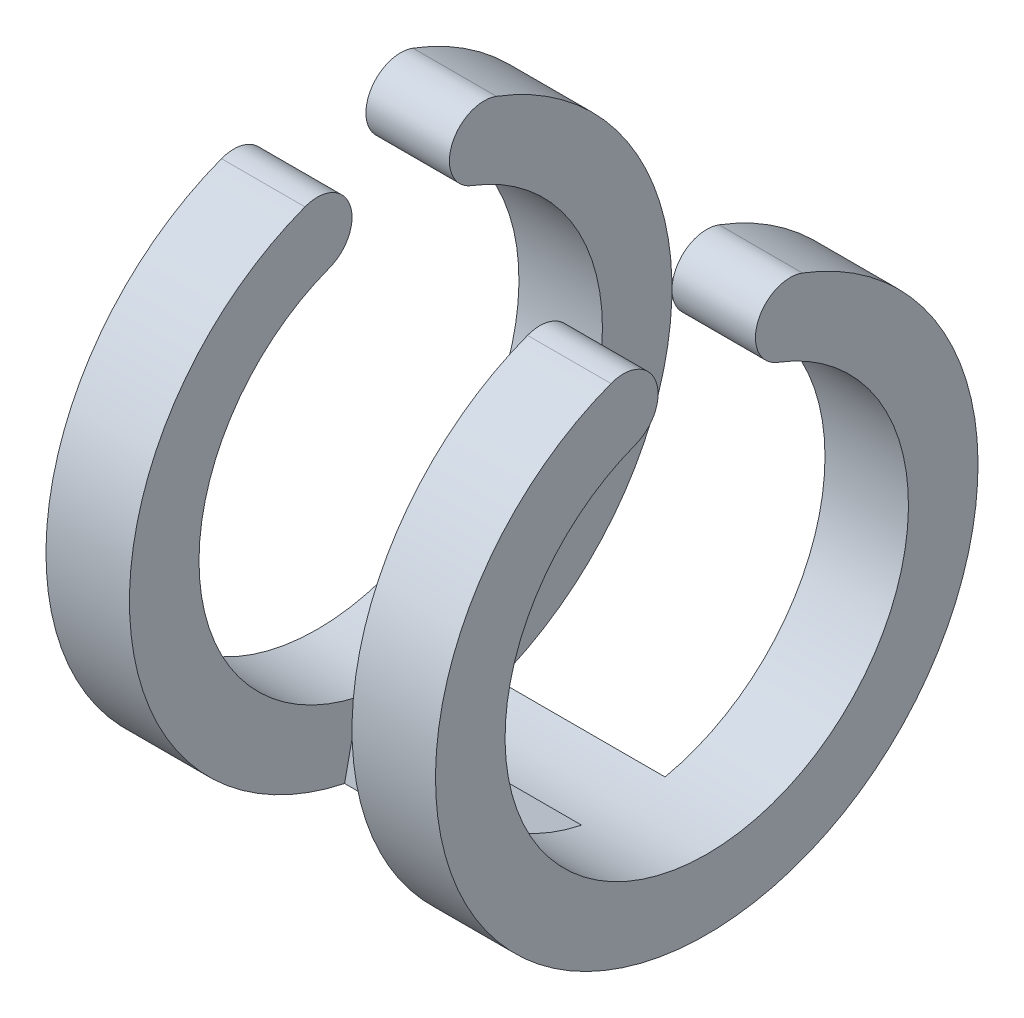
ISO-10303-21;
HEADER;
FILE_DESCRIPTION(('STEP AP214'),'2;1');
FILE_NAME('part.step','',(''),(''),'','','');
FILE_SCHEMA(('AUTOMOTIVE_DESIGN { 1 0 10303 214 1 1 1 1 }'));
ENDSEC;
DATA;
#1=APPLICATION_CONTEXT('core data for automotive mechanical design processes');
#2=APPLICATION_PROTOCOL_DEFINITION('international standard','automotive_design',2000,#1);
#3=PRODUCT_CONTEXT('',#1,'mechanical');
#4=PRODUCT('Part','Part','',(#3));
#5=PRODUCT_RELATED_PRODUCT_CATEGORY('part','',(#4));
#6=PRODUCT_DEFINITION_FORMATION('','',#4);
#7=PRODUCT_DEFINITION_CONTEXT('part definition',#1,'design');
#8=PRODUCT_DEFINITION('design','',#6,#7);
#9=PRODUCT_DEFINITION_SHAPE('','',#8);
#10=(LENGTH_UNIT() NAMED_UNIT(*) SI_UNIT(.MILLI.,.METRE.));
#11=(NAMED_UNIT(*) PLANE_ANGLE_UNIT() SI_UNIT($,.RADIAN.));
#12=(NAMED_UNIT(*) SI_UNIT($,.STERADIAN.) SOLID_ANGLE_UNIT());
#13=UNCERTAINTY_MEASURE_WITH_UNIT(LENGTH_MEASURE(1.E-05),#10,'distance_accuracy_value','');
#14=(GEOMETRIC_REPRESENTATION_CONTEXT(3) GLOBAL_UNCERTAINTY_ASSIGNED_CONTEXT((#13)) GLOBAL_UNIT_ASSIGNED_CONTEXT((#10,
#11,#12)) REPRESENTATION_CONTEXT('',''));
#15=CARTESIAN_POINT('',(0.,0.,0.));
#16=DIRECTION('',(0.,0.,1.));
#17=DIRECTION('',(1.,0.,0.));
#18=AXIS2_PLACEMENT_3D('',#15,#16,#17);
#19=CARTESIAN_POINT('',(75.5,15.7264934301467,-3.));
#20=DIRECTION('',(1.,0.,0.));
#21=DIRECTION('',(0.,1.,0.));
#22=AXIS2_PLACEMENT_3D('',#19,#20,#21);
#23=PLANE('',#22);
#24=CARTESIAN_POINT('',(75.5,23.9529868602934,0.));
#25=DIRECTION('',(1.,0.,0.));
#26=DIRECTION('',(0.,-0.935645512975694,-0.352941176470598));
#27=AXIS2_PLACEMENT_3D('',#24,#25,#26);
#28=CIRCLE('',#27,1.24999999999995);
#29=CARTESIAN_POINT('',(75.5,22.7834299690738,-0.44117647058823));
#30=VERTEX_POINT('',#29);
#31=CARTESIAN_POINT('',(75.5,25.122543751513,0.441176470588231));
#32=VERTEX_POINT('',#31);
#33=EDGE_CURVE('E11',#30,#32,#28,.T.);
#34=ORIENTED_EDGE('',*,*,#33,.F.);
#35=CARTESIAN_POINT('',(75.5,16.,-3.));
#36=DIRECTION('',(1.,0.,0.));
#37=DIRECTION('',(0.,0.935645512975698,0.352941176470589));
#38=AXIS2_PLACEMENT_3D('',#35,#36,#37);
#39=CIRCLE('',#38,7.25);
#40=CARTESIAN_POINT('',(75.5,22.7834299690738,-5.55882352941176));
#41=VERTEX_POINT('',#40);
#42=EDGE_CURVE('E187',#30,#41,#39,.T.);
#43=ORIENTED_EDGE('',*,*,#42,.T.);
#44=CARTESIAN_POINT('',(75.5,23.9529868602934,-6.));
#45=DIRECTION('',(1.,0.,0.));
#46=DIRECTION('',(0.,0.935645512975701,-0.35294117647058));
#47=AXIS2_PLACEMENT_3D('',#44,#45,#46);
#48=CIRCLE('',#47,1.25000000000004);
#49=CARTESIAN_POINT('',(75.5,25.1225437515131,-6.44117647058824));
#50=VERTEX_POINT('',#49);
#51=EDGE_CURVE('E197',#50,#41,#48,.T.);
#52=ORIENTED_EDGE('',*,*,#51,.F.);
#53=CARTESIAN_POINT('',(75.5,16.,-3.));
#54=DIRECTION('',(1.,0.,0.));
#55=DIRECTION('',(0.,0.935645512975698,0.352941176470589));
#56=AXIS2_PLACEMENT_3D('',#53,#54,#55);
#57=CIRCLE('',#56,9.75);
#58=EDGE_CURVE('E49',#32,#50,#57,.T.);
#59=ORIENTED_EDGE('',*,*,#58,.F.);
#60=EDGE_LOOP('',(#34,#43,#52,#59));
#61=FACE_BOUND('',#60,.T.);
#62=ADVANCED_FACE('F17',(#61),#23,.F.);
#63=CARTESIAN_POINT('',(75.5,23.9529868602934,0.));
#64=DIRECTION('',(1.,0.,0.));
#65=DIRECTION('',(0.,-0.935645512975694,-0.352941176470598));
#66=AXIS2_PLACEMENT_3D('',#63,#64,#65);
#67=CYLINDRICAL_SURFACE('',#66,1.24999999999995);
#68=ORIENTED_EDGE('',*,*,#33,.T.);
#69=DIRECTION('',(1.,0.,0.));
#70=VECTOR('',#69,1.);
#71=CARTESIAN_POINT('',(75.5,25.122543751513,0.441176470588231));
#72=LINE('',#71,#70);
#73=CARTESIAN_POINT('',(78.5,25.122543751513,0.441176470588231));
#74=VERTEX_POINT('',#73);
#75=EDGE_CURVE('E26',#32,#74,#72,.T.);
#76=ORIENTED_EDGE('',*,*,#75,.T.);
#77=CARTESIAN_POINT('',(78.5,23.9529868602934,0.));
#78=DIRECTION('',(1.,0.,0.));
#79=DIRECTION('',(0.,-0.935645512975694,-0.352941176470598));
#80=AXIS2_PLACEMENT_3D('',#77,#78,#79);
#81=CIRCLE('',#80,1.24999999999995);
#82=CARTESIAN_POINT('',(78.5,22.7834299690738,-0.44117647058823));
#83=VERTEX_POINT('',#82);
#84=EDGE_CURVE('E195',#83,#74,#81,.T.);
#85=ORIENTED_EDGE('',*,*,#84,.F.);
#86=DIRECTION('',(1.,0.,0.));
#87=VECTOR('',#86,1.);
#88=CARTESIAN_POINT('',(75.5,22.7834299690738,-0.44117647058823));
#89=LINE('',#88,#87);
#90=EDGE_CURVE('E71',#30,#83,#89,.T.);
#91=ORIENTED_EDGE('',*,*,#90,.F.);
#92=EDGE_LOOP('',(#68,#76,#85,#91));
#93=FACE_BOUND('',#92,.T.);
#94=ADVANCED_FACE('F394',(#93),#67,.T.);
#95=CARTESIAN_POINT('',(75.5,16.,-3.));
#96=DIRECTION('',(1.,0.,0.));
#97=DIRECTION('',(0.,-1.,0.));
#98=AXIS2_PLACEMENT_3D('',#95,#96,#97);
#99=CYLINDRICAL_SURFACE('',#98,9.75);
#100=ORIENTED_EDGE('',*,*,#58,.T.);
#101=DIRECTION('',(1.,0.,0.));
#102=VECTOR('',#101,1.);
#103=CARTESIAN_POINT('',(75.5,25.1225437515131,-6.44117647058824));
#104=LINE('',#103,#102);
#105=CARTESIAN_POINT('',(78.5,25.1225437515131,-6.44117647058824));
#106=VERTEX_POINT('',#105);
#107=EDGE_CURVE('E186',#50,#106,#104,.T.);
#108=ORIENTED_EDGE('',*,*,#107,.T.);
#109=CARTESIAN_POINT('',(78.5,16.,-3.));
#110=DIRECTION('',(1.,0.,0.));
#111=DIRECTION('',(0.,0.935645512975698,0.352941176470589));
#112=AXIS2_PLACEMENT_3D('',#109,#110,#111);
#113=CIRCLE('',#112,9.75);
#114=CARTESIAN_POINT('',(78.5,6.46096245852886,-5.01724137931027));
#115=VERTEX_POINT('',#114);
#116=EDGE_CURVE('E83',#115,#106,#113,.T.);
#117=ORIENTED_EDGE('',*,*,#116,.F.);
#118=DIRECTION('',(1.,0.,0.));
#119=VECTOR('',#118,1.);
#120=CARTESIAN_POINT('',(78.5,6.46096245852886,-5.01724137931027));
#121=LINE('',#120,#119);
#122=CARTESIAN_POINT('',(86.5,6.46096245852886,-5.01724137931027));
#123=VERTEX_POINT('',#122);
#124=EDGE_CURVE('E159',#115,#123,#121,.T.);
#125=ORIENTED_EDGE('',*,*,#124,.T.);
#126=CARTESIAN_POINT('',(86.5,16.,-3.));
#127=DIRECTION('',(1.,0.,0.));
#128=DIRECTION('',(0.,0.935645512975697,0.352941176470591));
#129=AXIS2_PLACEMENT_3D('',#126,#127,#128);
#130=CIRCLE('',#129,9.75);
#131=CARTESIAN_POINT('',(86.5,25.1225437515131,-6.44117647058824));
#132=VERTEX_POINT('',#131);
#133=EDGE_CURVE('E157',#123,#132,#130,.T.);
#134=ORIENTED_EDGE('',*,*,#133,.T.);
#135=DIRECTION('',(1.,0.,0.));
#136=VECTOR('',#135,1.);
#137=CARTESIAN_POINT('',(86.5,25.1225437515131,-6.44117647058824));
#138=LINE('',#137,#136);
#139=CARTESIAN_POINT('',(89.5,25.1225437515131,-6.44117647058824));
#140=VERTEX_POINT('',#139);
#141=EDGE_CURVE('E144',#132,#140,#138,.T.);
#142=ORIENTED_EDGE('',*,*,#141,.T.);
#143=CARTESIAN_POINT('',(89.5,16.,-3.));
#144=DIRECTION('',(1.,0.,0.));
#145=DIRECTION('',(0.,0.935645512975697,0.352941176470591));
#146=AXIS2_PLACEMENT_3D('',#143,#144,#145);
#147=CIRCLE('',#146,9.75);
#148=CARTESIAN_POINT('',(89.5,25.1225437515131,0.441176470588232));
#149=VERTEX_POINT('',#148);
#150=EDGE_CURVE('E227',#149,#140,#147,.T.);
#151=ORIENTED_EDGE('',*,*,#150,.F.);
#152=DIRECTION('',(1.,0.,0.));
#153=VECTOR('',#152,1.);
#154=CARTESIAN_POINT('',(86.5,25.1225437515131,0.441176470588232));
#155=LINE('',#154,#153);
#156=CARTESIAN_POINT('',(86.5,25.1225437515131,0.441176470588232));
#157=VERTEX_POINT('',#156);
#158=EDGE_CURVE('E154',#157,#149,#155,.T.);
#159=ORIENTED_EDGE('',*,*,#158,.F.);
#160=CARTESIAN_POINT('',(86.5,16.,-3.));
#161=DIRECTION('',(1.,0.,0.));
#162=DIRECTION('',(0.,0.935645512975697,0.352941176470591));
#163=AXIS2_PLACEMENT_3D('',#160,#161,#162);
#164=CIRCLE('',#163,9.75);
#165=CARTESIAN_POINT('',(86.5,6.46096245852886,-0.982758620689727));
#166=VERTEX_POINT('',#165);
#167=EDGE_CURVE('E183',#157,#166,#164,.T.);
#168=ORIENTED_EDGE('',*,*,#167,.T.);
#169=DIRECTION('',(1.,0.,0.));
#170=VECTOR('',#169,1.);
#171=CARTESIAN_POINT('',(78.5,6.46096245852886,-0.982758620689727));
#172=LINE('',#171,#170);
#173=CARTESIAN_POINT('',(78.5,6.46096245852886,-0.982758620689727));
#174=VERTEX_POINT('',#173);
#175=EDGE_CURVE('E251',#174,#166,#172,.T.);
#176=ORIENTED_EDGE('',*,*,#175,.F.);
#177=CARTESIAN_POINT('',(78.5,16.,-3.));
#178=DIRECTION('',(1.,0.,0.));
#179=DIRECTION('',(0.,0.935645512975698,0.352941176470589));
#180=AXIS2_PLACEMENT_3D('',#177,#178,#179);
#181=CIRCLE('',#180,9.75);
#182=EDGE_CURVE('E192',#74,#174,#181,.T.);
#183=ORIENTED_EDGE('',*,*,#182,.F.);
#184=ORIENTED_EDGE('',*,*,#75,.F.);
#185=EDGE_LOOP('',(#100,#108,#117,#125,#134,#142,#151,#159,#168,#176,#183,#184));
#186=FACE_BOUND('',#185,.T.);
#187=ADVANCED_FACE('F158',(#186),#99,.T.);
#188=CARTESIAN_POINT('',(75.5,23.9529868602934,-6.));
#189=DIRECTION('',(1.,0.,0.));
#190=DIRECTION('',(0.,0.935645512975701,-0.35294117647058));
#191=AXIS2_PLACEMENT_3D('',#188,#189,#190);
#192=CYLINDRICAL_SURFACE('',#191,1.25000000000004);
#193=ORIENTED_EDGE('',*,*,#51,.T.);
#194=DIRECTION('',(1.,0.,0.));
#195=VECTOR('',#194,1.);
#196=CARTESIAN_POINT('',(75.5,22.7834299690738,-5.55882352941176));
#197=LINE('',#196,#195);
#198=CARTESIAN_POINT('',(78.5,22.7834299690738,-5.55882352941176));
#199=VERTEX_POINT('',#198);
#200=EDGE_CURVE('E199',#41,#199,#197,.T.);
#201=ORIENTED_EDGE('',*,*,#200,.T.);
#202=CARTESIAN_POINT('',(78.5,23.9529868602934,-6.));
#203=DIRECTION('',(1.,0.,0.));
#204=DIRECTION('',(0.,0.935645512975701,-0.35294117647058));
#205=AXIS2_PLACEMENT_3D('',#202,#203,#204);
#206=CIRCLE('',#205,1.25000000000004);
#207=EDGE_CURVE('E225',#106,#199,#206,.T.);
#208=ORIENTED_EDGE('',*,*,#207,.F.);
#209=ORIENTED_EDGE('',*,*,#107,.F.);
#210=EDGE_LOOP('',(#193,#201,#208,#209));
#211=FACE_BOUND('',#210,.T.);
#212=ADVANCED_FACE('F384',(#211),#192,.T.);
#213=CARTESIAN_POINT('',(75.5,16.,-3.));
#214=DIRECTION('',(1.,0.,0.));
#215=DIRECTION('',(0.,-1.,0.));
#216=AXIS2_PLACEMENT_3D('',#213,#214,#215);
#217=CYLINDRICAL_SURFACE('',#216,7.25);
#218=ORIENTED_EDGE('',*,*,#42,.F.);
#219=ORIENTED_EDGE('',*,*,#90,.T.);
#220=CARTESIAN_POINT('',(78.5,16.,-3.));
#221=DIRECTION('',(-1.,0.,0.));
#222=DIRECTION('',(0.,0.935645512975698,0.352941176470589));
#223=AXIS2_PLACEMENT_3D('',#220,#221,#222);
#224=CIRCLE('',#223,7.25);
#225=CARTESIAN_POINT('',(78.5,8.90686952044448,-1.5));
#226=VERTEX_POINT('',#225);
#227=EDGE_CURVE('E246',#226,#83,#224,.T.);
#228=ORIENTED_EDGE('',*,*,#227,.F.);
#229=DIRECTION('',(1.,0.,0.));
#230=VECTOR('',#229,1.);
#231=CARTESIAN_POINT('',(78.5,8.90686952044448,-1.5));
#232=LINE('',#231,#230);
#233=CARTESIAN_POINT('',(86.5,8.90686952044448,-1.5));
#234=VERTEX_POINT('',#233);
#235=EDGE_CURVE('E179',#226,#234,#232,.T.);
#236=ORIENTED_EDGE('',*,*,#235,.T.);
#237=CARTESIAN_POINT('',(86.5,16.,-3.));
#238=DIRECTION('',(1.,0.,0.));
#239=DIRECTION('',(0.,0.935645512975698,0.352941176470589));
#240=AXIS2_PLACEMENT_3D('',#237,#238,#239);
#241=CIRCLE('',#240,7.25);
#242=CARTESIAN_POINT('',(86.5,22.7834299690738,-0.44117647058823));
#243=VERTEX_POINT('',#242);
#244=EDGE_CURVE('E240',#243,#234,#241,.T.);
#245=ORIENTED_EDGE('',*,*,#244,.F.);
#246=DIRECTION('',(1.,0.,0.));
#247=VECTOR('',#246,1.);
#248=CARTESIAN_POINT('',(86.5,22.7834299690738,-0.44117647058823));
#249=LINE('',#248,#247);
#250=CARTESIAN_POINT('',(89.5,22.7834299690738,-0.44117647058823));
#251=VERTEX_POINT('',#250);
#252=EDGE_CURVE('E231',#243,#251,#249,.T.);
#253=ORIENTED_EDGE('',*,*,#252,.T.);
#254=CARTESIAN_POINT('',(89.5,16.,-3.));
#255=DIRECTION('',(-1.,0.,0.));
#256=DIRECTION('',(0.,0.935645512975698,0.352941176470589));
#257=AXIS2_PLACEMENT_3D('',#254,#255,#256);
#258=CIRCLE('',#257,7.25);
#259=CARTESIAN_POINT('',(89.5,22.7834299690738,-5.55882352941176));
#260=VERTEX_POINT('',#259);
#261=EDGE_CURVE('E230',#260,#251,#258,.T.);
#262=ORIENTED_EDGE('',*,*,#261,.F.);
#263=DIRECTION('',(1.,0.,0.));
#264=VECTOR('',#263,1.);
#265=CARTESIAN_POINT('',(86.5,22.7834299690738,-5.55882352941176));
#266=LINE('',#265,#264);
#267=CARTESIAN_POINT('',(86.5,22.7834299690738,-5.55882352941176));
#268=VERTEX_POINT('',#267);
#269=EDGE_CURVE('E20',#268,#260,#266,.T.);
#270=ORIENTED_EDGE('',*,*,#269,.F.);
#271=CARTESIAN_POINT('',(86.5,16.,-3.));
#272=DIRECTION('',(1.,0.,0.));
#273=DIRECTION('',(0.,0.935645512975698,0.352941176470589));
#274=AXIS2_PLACEMENT_3D('',#271,#272,#273);
#275=CIRCLE('',#274,7.25);
#276=CARTESIAN_POINT('',(86.5,8.90686952044448,-4.5));
#277=VERTEX_POINT('',#276);
#278=EDGE_CURVE('E168',#277,#268,#275,.T.);
#279=ORIENTED_EDGE('',*,*,#278,.F.);
#280=DIRECTION('',(1.,0.,0.));
#281=VECTOR('',#280,1.);
#282=CARTESIAN_POINT('',(78.5,8.90686952044448,-4.5));
#283=LINE('',#282,#281);
#284=CARTESIAN_POINT('',(78.5,8.90686952044448,-4.5));
#285=VERTEX_POINT('',#284);
#286=EDGE_CURVE('E219',#285,#277,#283,.T.);
#287=ORIENTED_EDGE('',*,*,#286,.F.);
#288=CARTESIAN_POINT('',(78.5,16.,-3.));
#289=DIRECTION('',(-1.,0.,0.));
#290=DIRECTION('',(0.,0.935645512975698,0.352941176470589));
#291=AXIS2_PLACEMENT_3D('',#288,#289,#290);
#292=CIRCLE('',#291,7.25);
#293=EDGE_CURVE('E191',#199,#285,#292,.T.);
#294=ORIENTED_EDGE('',*,*,#293,.F.);
#295=ORIENTED_EDGE('',*,*,#200,.F.);
#296=EDGE_LOOP('',(#218,#219,#228,#236,#245,#253,#262,#270,#279,#287,#294,#295));
#297=FACE_BOUND('',#296,.T.);
#298=ADVANCED_FACE('F268',(#297),#217,.F.);
#299=CARTESIAN_POINT('',(78.5,15.7264934301467,-3.));
#300=DIRECTION('',(1.,0.,0.));
#301=DIRECTION('',(0.,1.,0.));
#302=AXIS2_PLACEMENT_3D('',#299,#300,#301);
#303=PLANE('',#302);
#304=DIRECTION('',(0.,-0.978362824766288,-0.206896551724117));
#305=VECTOR('',#304,1.);
#306=CARTESIAN_POINT('',(78.5,11.099581830494,-4.03630227520077));
#307=LINE('',#306,#305);
#308=EDGE_CURVE('E222',#285,#115,#307,.T.);
#309=ORIENTED_EDGE('',*,*,#308,.T.);
#310=ORIENTED_EDGE('',*,*,#116,.T.);
#311=ORIENTED_EDGE('',*,*,#207,.T.);
#312=ORIENTED_EDGE('',*,*,#293,.T.);
#313=EDGE_LOOP('',(#309,#310,#311,#312));
#314=FACE_BOUND('',#313,.T.);
#315=ADVANCED_FACE('F381',(#314),#303,.T.);
#316=CARTESIAN_POINT('',(78.5,15.7264934301467,-3.));
#317=DIRECTION('',(1.,0.,0.));
#318=DIRECTION('',(0.,1.,0.));
#319=AXIS2_PLACEMENT_3D('',#316,#317,#318);
#320=PLANE('',#319);
#321=DIRECTION('',(0.,0.978362824766288,-0.206896551724117));
#322=VECTOR('',#321,1.);
#323=CARTESIAN_POINT('',(78.5,12.3225353614518,-2.22231841445436));
#324=LINE('',#323,#322);
#325=EDGE_CURVE('E217',#174,#226,#324,.T.);
#326=ORIENTED_EDGE('',*,*,#325,.T.);
#327=ORIENTED_EDGE('',*,*,#227,.T.);
#328=ORIENTED_EDGE('',*,*,#84,.T.);
#329=ORIENTED_EDGE('',*,*,#182,.T.);
#330=EDGE_LOOP('',(#326,#327,#328,#329));
#331=FACE_BOUND('',#330,.T.);
#332=ADVANCED_FACE('F265',(#331),#320,.T.);
#333=CARTESIAN_POINT('',(78.5,6.46096245852886,-5.01724137931027));
#334=DIRECTION('',(0.,0.206896551724117,-0.978362824766288));
#335=DIRECTION('',(-1.,0.,0.));
#336=AXIS2_PLACEMENT_3D('',#333,#334,#335);
#337=PLANE('',#336);
#338=ORIENTED_EDGE('',*,*,#308,.F.);
#339=ORIENTED_EDGE('',*,*,#286,.T.);
#340=DIRECTION('',(0.,0.978362824766288,0.206896551724117));
#341=VECTOR('',#340,1.);
#342=CARTESIAN_POINT('',(86.5,6.46096245852886,-5.01724137931027));
#343=LINE('',#342,#341);
#344=EDGE_CURVE('E175',#123,#277,#343,.T.);
#345=ORIENTED_EDGE('',*,*,#344,.F.);
#346=ORIENTED_EDGE('',*,*,#124,.F.);
#347=EDGE_LOOP('',(#338,#339,#345,#346));
#348=FACE_BOUND('',#347,.T.);
#349=ADVANCED_FACE('F405',(#348),#337,.T.);
#350=CARTESIAN_POINT('',(78.5,8.90686952044448,-1.5));
#351=DIRECTION('',(0.,0.206896551724117,0.978362824766288));
#352=DIRECTION('',(1.,0.,0.));
#353=AXIS2_PLACEMENT_3D('',#350,#351,#352);
#354=PLANE('',#353);
#355=ORIENTED_EDGE('',*,*,#325,.F.);
#356=ORIENTED_EDGE('',*,*,#175,.T.);
#357=DIRECTION('',(0.,-0.978362824766288,0.206896551724117));
#358=VECTOR('',#357,1.);
#359=CARTESIAN_POINT('',(86.5,6.46096245852886,-0.982758620689727));
#360=LINE('',#359,#358);
#361=EDGE_CURVE('E164',#234,#166,#360,.T.);
#362=ORIENTED_EDGE('',*,*,#361,.F.);
#363=ORIENTED_EDGE('',*,*,#235,.F.);
#364=EDGE_LOOP('',(#355,#356,#362,#363));
#365=FACE_BOUND('',#364,.T.);
#366=ADVANCED_FACE('F272',(#365),#354,.T.);
#367=CARTESIAN_POINT('',(89.5,15.7264934301468,-3.));
#368=DIRECTION('',(1.,0.,0.));
#369=DIRECTION('',(0.,1.,0.));
#370=AXIS2_PLACEMENT_3D('',#367,#368,#369);
#371=PLANE('',#370);
#372=CARTESIAN_POINT('',(89.5,23.9529868602935,0.));
#373=DIRECTION('',(1.,0.,0.));
#374=DIRECTION('',(0.,-0.9356455129757,-0.352941176470584));
#375=AXIS2_PLACEMENT_3D('',#372,#373,#374);
#376=CIRCLE('',#375,1.25);
#377=EDGE_CURVE('E234',#251,#149,#376,.T.);
#378=ORIENTED_EDGE('',*,*,#377,.T.);
#379=ORIENTED_EDGE('',*,*,#150,.T.);
#380=CARTESIAN_POINT('',(89.5,23.9529868602935,-6.));
#381=DIRECTION('',(1.,0.,0.));
#382=DIRECTION('',(0.,0.935645512975697,-0.352941176470591));
#383=AXIS2_PLACEMENT_3D('',#380,#381,#382);
#384=CIRCLE('',#383,1.25);
#385=EDGE_CURVE('E152',#140,#260,#384,.T.);
#386=ORIENTED_EDGE('',*,*,#385,.T.);
#387=ORIENTED_EDGE('',*,*,#261,.T.);
#388=EDGE_LOOP('',(#378,#379,#386,#387));
#389=FACE_BOUND('',#388,.T.);
#390=ADVANCED_FACE('F413',(#389),#371,.T.);
#391=CARTESIAN_POINT('',(86.5,23.9529868602935,0.));
#392=DIRECTION('',(1.,0.,0.));
#393=DIRECTION('',(0.,-0.9356455129757,-0.352941176470584));
#394=AXIS2_PLACEMENT_3D('',#391,#392,#393);
#395=CYLINDRICAL_SURFACE('',#394,1.25);
#396=CARTESIAN_POINT('',(86.5,23.9529868602935,0.));
#397=DIRECTION('',(1.,0.,0.));
#398=DIRECTION('',(0.,-0.9356455129757,-0.352941176470584));
#399=AXIS2_PLACEMENT_3D('',#396,#397,#398);
#400=CIRCLE('',#399,1.25);
#401=EDGE_CURVE('E238',#243,#157,#400,.T.);
#402=ORIENTED_EDGE('',*,*,#401,.T.);
#403=ORIENTED_EDGE('',*,*,#158,.T.);
#404=ORIENTED_EDGE('',*,*,#377,.F.);
#405=ORIENTED_EDGE('',*,*,#252,.F.);
#406=EDGE_LOOP('',(#402,#403,#404,#405));
#407=FACE_BOUND('',#406,.T.);
#408=ADVANCED_FACE('F422',(#407),#395,.T.);
#409=CARTESIAN_POINT('',(86.5,23.9529868602935,-6.));
#410=DIRECTION('',(1.,0.,0.));
#411=DIRECTION('',(0.,0.935645512975697,-0.352941176470591));
#412=AXIS2_PLACEMENT_3D('',#409,#410,#411);
#413=CYLINDRICAL_SURFACE('',#412,1.25);
#414=CARTESIAN_POINT('',(86.5,23.9529868602935,-6.));
#415=DIRECTION('',(1.,0.,0.));
#416=DIRECTION('',(0.,0.935645512975697,-0.352941176470591));
#417=AXIS2_PLACEMENT_3D('',#414,#415,#416);
#418=CIRCLE('',#417,1.25);
#419=EDGE_CURVE('E149',#132,#268,#418,.T.);
#420=ORIENTED_EDGE('',*,*,#419,.T.);
#421=ORIENTED_EDGE('',*,*,#269,.T.);
#422=ORIENTED_EDGE('',*,*,#385,.F.);
#423=ORIENTED_EDGE('',*,*,#141,.F.);
#424=EDGE_LOOP('',(#420,#421,#422,#423));
#425=FACE_BOUND('',#424,.T.);
#426=ADVANCED_FACE('F146',(#425),#413,.T.);
#427=CARTESIAN_POINT('',(86.5,15.7264934301468,-3.));
#428=DIRECTION('',(1.,0.,0.));
#429=DIRECTION('',(0.,1.,0.));
#430=AXIS2_PLACEMENT_3D('',#427,#428,#429);
#431=PLANE('',#430);
#432=ORIENTED_EDGE('',*,*,#361,.T.);
#433=ORIENTED_EDGE('',*,*,#167,.F.);
#434=ORIENTED_EDGE('',*,*,#401,.F.);
#435=ORIENTED_EDGE('',*,*,#244,.T.);
#436=EDGE_LOOP('',(#432,#433,#434,#435));
#437=FACE_BOUND('',#436,.T.);
#438=ADVANCED_FACE('F417',(#437),#431,.F.);
#439=CARTESIAN_POINT('',(86.5,15.7264934301468,-3.));
#440=DIRECTION('',(1.,0.,0.));
#441=DIRECTION('',(0.,1.,0.));
#442=AXIS2_PLACEMENT_3D('',#439,#440,#441);
#443=PLANE('',#442);
#444=ORIENTED_EDGE('',*,*,#344,.T.);
#445=ORIENTED_EDGE('',*,*,#278,.T.);
#446=ORIENTED_EDGE('',*,*,#419,.F.);
#447=ORIENTED_EDGE('',*,*,#133,.F.);
#448=EDGE_LOOP('',(#444,#445,#446,#447));
#449=FACE_BOUND('',#448,.T.);
#450=ADVANCED_FACE('F166',(#449),#443,.F.);
#451=CLOSED_SHELL('',(#62,#94,#187,#212,#298,#315,#332,#349,#366,#390,#408,#426,#438,#450));
#452=MANIFOLD_SOLID_BREP('B1',#451);
#453=ADVANCED_BREP_SHAPE_REPRESENTATION('',(#18,#452),#14);
#454=SHAPE_DEFINITION_REPRESENTATION(#9,#453);
ENDSEC;
END-ISO-10303-21;
